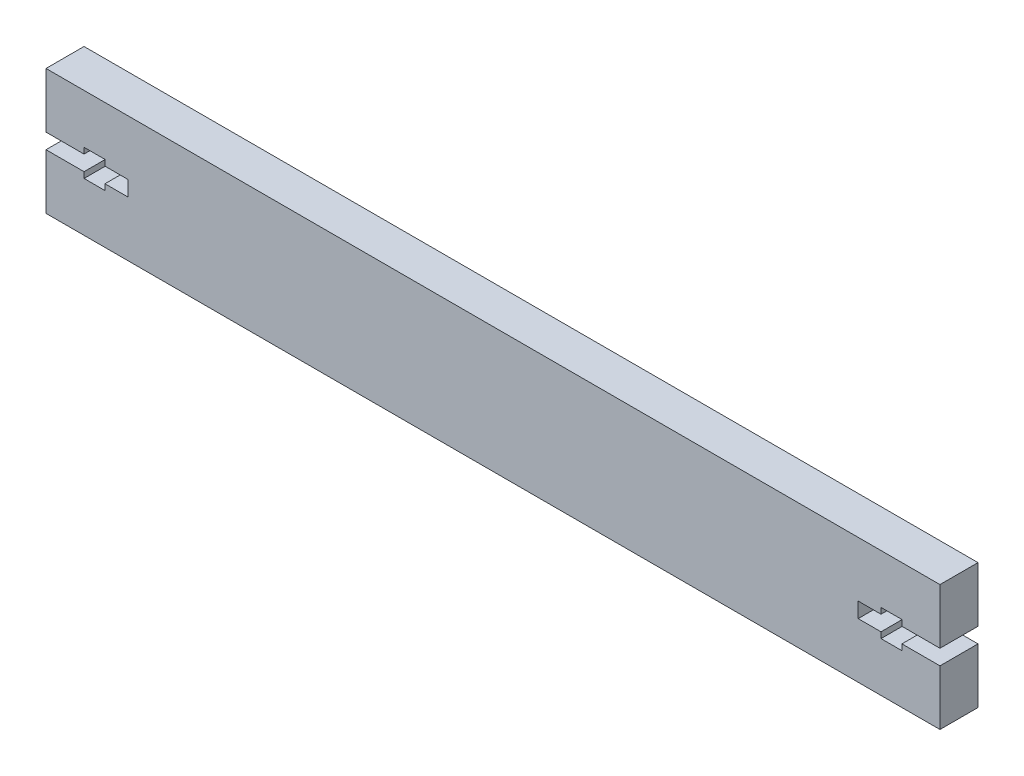
ISO-10303-21;
HEADER;
FILE_DESCRIPTION(('STEP AP214'),'2;1');
FILE_NAME('part.step','',(''),(''),'','','');
FILE_SCHEMA(('AUTOMOTIVE_DESIGN { 1 0 10303 214 1 1 1 1 }'));
ENDSEC;
DATA;
#1=APPLICATION_CONTEXT('core data for automotive mechanical design processes');
#2=APPLICATION_PROTOCOL_DEFINITION('international standard','automotive_design',2000,#1);
#3=PRODUCT_CONTEXT('',#1,'mechanical');
#4=PRODUCT('Part','Part','',(#3));
#5=PRODUCT_RELATED_PRODUCT_CATEGORY('part','',(#4));
#6=PRODUCT_DEFINITION_FORMATION('','',#4);
#7=PRODUCT_DEFINITION_CONTEXT('part definition',#1,'design');
#8=PRODUCT_DEFINITION('design','',#6,#7);
#9=PRODUCT_DEFINITION_SHAPE('','',#8);
#10=(LENGTH_UNIT() NAMED_UNIT(*) SI_UNIT(.MILLI.,.METRE.));
#11=(NAMED_UNIT(*) PLANE_ANGLE_UNIT() SI_UNIT($,.RADIAN.));
#12=(NAMED_UNIT(*) SI_UNIT($,.STERADIAN.) SOLID_ANGLE_UNIT());
#13=UNCERTAINTY_MEASURE_WITH_UNIT(LENGTH_MEASURE(1.E-05),#10,'distance_accuracy_value','');
#14=(GEOMETRIC_REPRESENTATION_CONTEXT(3) GLOBAL_UNCERTAINTY_ASSIGNED_CONTEXT((#13)) GLOBAL_UNIT_ASSIGNED_CONTEXT((#10,
#11,#12)) REPRESENTATION_CONTEXT('',''));
#15=CARTESIAN_POINT('',(0.,0.,0.));
#16=DIRECTION('',(0.,0.,1.));
#17=DIRECTION('',(1.,0.,0.));
#18=AXIS2_PLACEMENT_3D('',#15,#16,#17);
#19=CARTESIAN_POINT('',(117.5,16.5,10.));
#20=DIRECTION('',(-1.,0.,0.));
#21=DIRECTION('',(0.,0.,1.));
#22=AXIS2_PLACEMENT_3D('',#19,#20,#21);
#23=PLANE('',#22);
#24=DIRECTION('',(0.,1.,0.));
#25=VECTOR('',#24,1.);
#26=CARTESIAN_POINT('',(117.5,16.5,0.));
#27=LINE('',#26,#25);
#28=CARTESIAN_POINT('',(117.5,-16.5,0.));
#29=VERTEX_POINT('',#28);
#30=CARTESIAN_POINT('',(117.5,-2.0000000000001,0.));
#31=VERTEX_POINT('',#30);
#32=EDGE_CURVE('E250',#29,#31,#27,.T.);
#33=ORIENTED_EDGE('',*,*,#32,.T.);
#34=DIRECTION('',(0.,0.,1.));
#35=VECTOR('',#34,1.);
#36=CARTESIAN_POINT('',(117.5,-2.0000000000001,0.));
#37=LINE('',#36,#35);
#38=CARTESIAN_POINT('',(117.5,-2.0000000000001,10.));
#39=VERTEX_POINT('',#38);
#40=EDGE_CURVE('E361',#31,#39,#37,.T.);
#41=ORIENTED_EDGE('',*,*,#40,.T.);
#42=DIRECTION('',(0.,1.,0.));
#43=VECTOR('',#42,1.);
#44=CARTESIAN_POINT('',(117.5,16.5,10.));
#45=LINE('',#44,#43);
#46=CARTESIAN_POINT('',(117.5,-16.5,10.));
#47=VERTEX_POINT('',#46);
#48=EDGE_CURVE('E425',#47,#39,#45,.T.);
#49=ORIENTED_EDGE('',*,*,#48,.F.);
#50=DIRECTION('',(0.,0.,-1.));
#51=VECTOR('',#50,1.);
#52=CARTESIAN_POINT('',(117.5,-16.5,10.));
#53=LINE('',#52,#51);
#54=EDGE_CURVE('E256',#47,#29,#53,.T.);
#55=ORIENTED_EDGE('',*,*,#54,.T.);
#56=EDGE_LOOP('',(#33,#41,#49,#55));
#57=FACE_BOUND('',#56,.T.);
#58=ADVANCED_FACE('F37',(#57),#23,.F.);
#59=CARTESIAN_POINT('',(-117.5,16.5,10.));
#60=DIRECTION('',(1.,0.,0.));
#61=DIRECTION('',(0.,1.,0.));
#62=AXIS2_PLACEMENT_3D('',#59,#60,#61);
#63=PLANE('',#62);
#64=DIRECTION('',(0.,-1.,0.));
#65=VECTOR('',#64,1.);
#66=CARTESIAN_POINT('',(-117.5,16.5,0.));
#67=LINE('',#66,#65);
#68=CARTESIAN_POINT('',(-117.5,16.5,0.));
#69=VERTEX_POINT('',#68);
#70=CARTESIAN_POINT('',(-117.5,2.,0.));
#71=VERTEX_POINT('',#70);
#72=EDGE_CURVE('E246',#69,#71,#67,.T.);
#73=ORIENTED_EDGE('',*,*,#72,.T.);
#74=DIRECTION('',(0.,0.,1.));
#75=VECTOR('',#74,1.);
#76=CARTESIAN_POINT('',(-117.5,2.,0.));
#77=LINE('',#76,#75);
#78=CARTESIAN_POINT('',(-117.5,2.,10.));
#79=VERTEX_POINT('',#78);
#80=EDGE_CURVE('E316',#71,#79,#77,.T.);
#81=ORIENTED_EDGE('',*,*,#80,.T.);
#82=DIRECTION('',(0.,-1.,0.));
#83=VECTOR('',#82,1.);
#84=CARTESIAN_POINT('',(-117.5,16.5,10.));
#85=LINE('',#84,#83);
#86=CARTESIAN_POINT('',(-117.5,16.5,10.));
#87=VERTEX_POINT('',#86);
#88=EDGE_CURVE('E269',#87,#79,#85,.T.);
#89=ORIENTED_EDGE('',*,*,#88,.F.);
#90=DIRECTION('',(0.,0.,-1.));
#91=VECTOR('',#90,1.);
#92=CARTESIAN_POINT('',(-117.5,16.5,10.));
#93=LINE('',#92,#91);
#94=EDGE_CURVE('E45',#87,#69,#93,.T.);
#95=ORIENTED_EDGE('',*,*,#94,.T.);
#96=EDGE_LOOP('',(#73,#81,#89,#95));
#97=FACE_BOUND('',#96,.T.);
#98=ADVANCED_FACE('F266',(#97),#63,.F.);
#99=CARTESIAN_POINT('',(117.5,1.9999999999999,10.));
#100=VERTEX_POINT('',#99);
#101=CARTESIAN_POINT('',(117.5,16.5,10.));
#102=VERTEX_POINT('',#101);
#103=EDGE_CURVE('E255',#100,#102,#45,.T.);
#104=ORIENTED_EDGE('',*,*,#103,.F.);
#105=DIRECTION('',(0.,0.,1.));
#106=VECTOR('',#105,1.);
#107=CARTESIAN_POINT('',(117.5,1.9999999999999,0.));
#108=LINE('',#107,#106);
#109=CARTESIAN_POINT('',(117.5,1.9999999999999,0.));
#110=VERTEX_POINT('',#109);
#111=EDGE_CURVE('E338',#110,#100,#108,.T.);
#112=ORIENTED_EDGE('',*,*,#111,.F.);
#113=CARTESIAN_POINT('',(117.5,16.5,0.));
#114=VERTEX_POINT('',#113);
#115=EDGE_CURVE('E318',#110,#114,#27,.T.);
#116=ORIENTED_EDGE('',*,*,#115,.T.);
#117=DIRECTION('',(0.,0.,-1.));
#118=VECTOR('',#117,1.);
#119=CARTESIAN_POINT('',(117.5,16.5,10.));
#120=LINE('',#119,#118);
#121=EDGE_CURVE('E11',#102,#114,#120,.T.);
#122=ORIENTED_EDGE('',*,*,#121,.F.);
#123=EDGE_LOOP('',(#104,#112,#116,#122));
#124=FACE_BOUND('',#123,.T.);
#125=ADVANCED_FACE('F39',(#124),#23,.F.);
#126=CARTESIAN_POINT('',(-117.5,16.5,10.));
#127=DIRECTION('',(0.,-1.,0.));
#128=DIRECTION('',(0.,0.,-1.));
#129=AXIS2_PLACEMENT_3D('',#126,#127,#128);
#130=PLANE('',#129);
#131=DIRECTION('',(-1.,0.,0.));
#132=VECTOR('',#131,1.);
#133=CARTESIAN_POINT('',(-117.5,16.5,0.));
#134=LINE('',#133,#132);
#135=EDGE_CURVE('E247',#114,#69,#134,.T.);
#136=ORIENTED_EDGE('',*,*,#135,.T.);
#137=ORIENTED_EDGE('',*,*,#94,.F.);
#138=DIRECTION('',(-1.,0.,0.));
#139=VECTOR('',#138,1.);
#140=CARTESIAN_POINT('',(-117.5,16.5,10.));
#141=LINE('',#140,#139);
#142=EDGE_CURVE('E428',#102,#87,#141,.T.);
#143=ORIENTED_EDGE('',*,*,#142,.F.);
#144=ORIENTED_EDGE('',*,*,#121,.T.);
#145=EDGE_LOOP('',(#136,#137,#143,#144));
#146=FACE_BOUND('',#145,.T.);
#147=ADVANCED_FACE('F493',(#146),#130,.F.);
#148=CARTESIAN_POINT('',(-117.5,-2.,10.));
#149=VERTEX_POINT('',#148);
#150=CARTESIAN_POINT('',(-117.5,-16.5,10.));
#151=VERTEX_POINT('',#150);
#152=EDGE_CURVE('E238',#149,#151,#85,.T.);
#153=ORIENTED_EDGE('',*,*,#152,.F.);
#154=DIRECTION('',(0.,0.,1.));
#155=VECTOR('',#154,1.);
#156=CARTESIAN_POINT('',(-117.5,-2.,0.));
#157=LINE('',#156,#155);
#158=CARTESIAN_POINT('',(-117.5,-2.,0.));
#159=VERTEX_POINT('',#158);
#160=EDGE_CURVE('E225',#159,#149,#157,.T.);
#161=ORIENTED_EDGE('',*,*,#160,.F.);
#162=CARTESIAN_POINT('',(-117.5,-16.5,0.));
#163=VERTEX_POINT('',#162);
#164=EDGE_CURVE('E236',#159,#163,#67,.T.);
#165=ORIENTED_EDGE('',*,*,#164,.T.);
#166=DIRECTION('',(0.,0.,-1.));
#167=VECTOR('',#166,1.);
#168=CARTESIAN_POINT('',(-117.5,-16.5,10.));
#169=LINE('',#168,#167);
#170=EDGE_CURVE('E259',#151,#163,#169,.T.);
#171=ORIENTED_EDGE('',*,*,#170,.F.);
#172=EDGE_LOOP('',(#153,#161,#165,#171));
#173=FACE_BOUND('',#172,.T.);
#174=ADVANCED_FACE('F234',(#173),#63,.F.);
#175=CARTESIAN_POINT('',(-117.5,-16.5,10.));
#176=DIRECTION('',(0.,1.,0.));
#177=DIRECTION('',(0.,0.,1.));
#178=AXIS2_PLACEMENT_3D('',#175,#176,#177);
#179=PLANE('',#178);
#180=DIRECTION('',(1.,0.,0.));
#181=VECTOR('',#180,1.);
#182=CARTESIAN_POINT('',(-117.5,-16.5,0.));
#183=LINE('',#182,#181);
#184=EDGE_CURVE('E245',#163,#29,#183,.T.);
#185=ORIENTED_EDGE('',*,*,#184,.T.);
#186=ORIENTED_EDGE('',*,*,#54,.F.);
#187=DIRECTION('',(1.,0.,0.));
#188=VECTOR('',#187,1.);
#189=CARTESIAN_POINT('',(-117.5,-16.5,10.));
#190=LINE('',#189,#188);
#191=EDGE_CURVE('E260',#151,#47,#190,.T.);
#192=ORIENTED_EDGE('',*,*,#191,.F.);
#193=ORIENTED_EDGE('',*,*,#170,.T.);
#194=EDGE_LOOP('',(#185,#186,#192,#193));
#195=FACE_BOUND('',#194,.T.);
#196=ADVANCED_FACE('F485',(#195),#179,.F.);
#197=CARTESIAN_POINT('',(0.,0.,10.));
#198=DIRECTION('',(0.,0.,1.));
#199=DIRECTION('',(1.,0.,0.));
#200=AXIS2_PLACEMENT_3D('',#197,#198,#199);
#201=PLANE('',#200);
#202=DIRECTION('',(-1.,0.,0.));
#203=VECTOR('',#202,1.);
#204=CARTESIAN_POINT('',(-117.5,2.,10.));
#205=LINE('',#204,#203);
#206=CARTESIAN_POINT('',(-107.5,2.,10.));
#207=VERTEX_POINT('',#206);
#208=EDGE_CURVE('E230',#207,#79,#205,.T.);
#209=ORIENTED_EDGE('',*,*,#208,.F.);
#210=DIRECTION('',(0.,-1.,0.));
#211=VECTOR('',#210,1.);
#212=CARTESIAN_POINT('',(-107.5,2.,10.));
#213=LINE('',#212,#211);
#214=CARTESIAN_POINT('',(-107.5,3.55,10.));
#215=VERTEX_POINT('',#214);
#216=EDGE_CURVE('E312',#215,#207,#213,.T.);
#217=ORIENTED_EDGE('',*,*,#216,.F.);
#218=DIRECTION('',(-1.,0.,0.));
#219=VECTOR('',#218,1.);
#220=CARTESIAN_POINT('',(-107.5,3.55,10.));
#221=LINE('',#220,#219);
#222=CARTESIAN_POINT('',(-102.,3.55,10.));
#223=VERTEX_POINT('',#222);
#224=EDGE_CURVE('E309',#223,#215,#221,.T.);
#225=ORIENTED_EDGE('',*,*,#224,.F.);
#226=DIRECTION('',(0.,1.,0.));
#227=VECTOR('',#226,1.);
#228=CARTESIAN_POINT('',(-102.,3.55,10.));
#229=LINE('',#228,#227);
#230=CARTESIAN_POINT('',(-102.,2.,10.));
#231=VERTEX_POINT('',#230);
#232=EDGE_CURVE('E306',#231,#223,#229,.T.);
#233=ORIENTED_EDGE('',*,*,#232,.F.);
#234=DIRECTION('',(-1.,0.,0.));
#235=VECTOR('',#234,1.);
#236=CARTESIAN_POINT('',(-102.,2.,10.));
#237=LINE('',#236,#235);
#238=CARTESIAN_POINT('',(-96.,2.,10.));
#239=VERTEX_POINT('',#238);
#240=EDGE_CURVE('E303',#239,#231,#237,.T.);
#241=ORIENTED_EDGE('',*,*,#240,.F.);
#242=DIRECTION('',(0.,1.,0.));
#243=VECTOR('',#242,1.);
#244=CARTESIAN_POINT('',(-96.,2.,10.));
#245=LINE('',#244,#243);
#246=CARTESIAN_POINT('',(-96.,-2.,10.));
#247=VERTEX_POINT('',#246);
#248=EDGE_CURVE('E300',#247,#239,#245,.T.);
#249=ORIENTED_EDGE('',*,*,#248,.F.);
#250=DIRECTION('',(1.,0.,0.));
#251=VECTOR('',#250,1.);
#252=CARTESIAN_POINT('',(-102.,-2.,10.));
#253=LINE('',#252,#251);
#254=CARTESIAN_POINT('',(-102.,-2.,10.));
#255=VERTEX_POINT('',#254);
#256=EDGE_CURVE('E297',#255,#247,#253,.T.);
#257=ORIENTED_EDGE('',*,*,#256,.F.);
#258=DIRECTION('',(0.,1.,0.));
#259=VECTOR('',#258,1.);
#260=CARTESIAN_POINT('',(-102.,-3.55,10.));
#261=LINE('',#260,#259);
#262=CARTESIAN_POINT('',(-102.,-3.55,10.));
#263=VERTEX_POINT('',#262);
#264=EDGE_CURVE('E294',#263,#255,#261,.T.);
#265=ORIENTED_EDGE('',*,*,#264,.F.);
#266=DIRECTION('',(1.,0.,0.));
#267=VECTOR('',#266,1.);
#268=CARTESIAN_POINT('',(-107.5,-3.55,10.));
#269=LINE('',#268,#267);
#270=CARTESIAN_POINT('',(-107.5,-3.55,10.));
#271=VERTEX_POINT('',#270);
#272=EDGE_CURVE('E291',#271,#263,#269,.T.);
#273=ORIENTED_EDGE('',*,*,#272,.F.);
#274=DIRECTION('',(0.,-1.,0.));
#275=VECTOR('',#274,1.);
#276=CARTESIAN_POINT('',(-107.5,-2.,10.));
#277=LINE('',#276,#275);
#278=CARTESIAN_POINT('',(-107.5,-2.,10.));
#279=VERTEX_POINT('',#278);
#280=EDGE_CURVE('E287',#279,#271,#277,.T.);
#281=ORIENTED_EDGE('',*,*,#280,.F.);
#282=DIRECTION('',(1.,0.,0.));
#283=VECTOR('',#282,1.);
#284=CARTESIAN_POINT('',(-117.5,-2.,10.));
#285=LINE('',#284,#283);
#286=EDGE_CURVE('E285',#149,#279,#285,.T.);
#287=ORIENTED_EDGE('',*,*,#286,.F.);
#288=ORIENTED_EDGE('',*,*,#152,.T.);
#289=ORIENTED_EDGE('',*,*,#191,.T.);
#290=ORIENTED_EDGE('',*,*,#48,.T.);
#291=DIRECTION('',(1.,0.,0.));
#292=VECTOR('',#291,1.);
#293=CARTESIAN_POINT('',(117.5,-2.0000000000001,10.));
#294=LINE('',#293,#292);
#295=CARTESIAN_POINT('',(107.5,-2.00000000000009,10.));
#296=VERTEX_POINT('',#295);
#297=EDGE_CURVE('E364',#296,#39,#294,.T.);
#298=ORIENTED_EDGE('',*,*,#297,.F.);
#299=DIRECTION('',(0.,1.,0.));
#300=VECTOR('',#299,1.);
#301=CARTESIAN_POINT('',(107.5,-2.00000000000009,10.));
#302=LINE('',#301,#300);
#303=CARTESIAN_POINT('',(107.5,-3.55000000000009,10.));
#304=VERTEX_POINT('',#303);
#305=EDGE_CURVE('E366',#304,#296,#302,.T.);
#306=ORIENTED_EDGE('',*,*,#305,.F.);
#307=DIRECTION('',(1.,0.,0.));
#308=VECTOR('',#307,1.);
#309=CARTESIAN_POINT('',(107.5,-3.55000000000009,10.));
#310=LINE('',#309,#308);
#311=CARTESIAN_POINT('',(102.,-3.55000000000008,10.));
#312=VERTEX_POINT('',#311);
#313=EDGE_CURVE('E370',#312,#304,#310,.T.);
#314=ORIENTED_EDGE('',*,*,#313,.F.);
#315=DIRECTION('',(0.,-1.,0.));
#316=VECTOR('',#315,1.);
#317=CARTESIAN_POINT('',(102.,-3.55000000000008,10.));
#318=LINE('',#317,#316);
#319=CARTESIAN_POINT('',(102.,-2.00000000000008,10.));
#320=VERTEX_POINT('',#319);
#321=EDGE_CURVE('E373',#320,#312,#318,.T.);
#322=ORIENTED_EDGE('',*,*,#321,.F.);
#323=DIRECTION('',(1.,0.,0.));
#324=VECTOR('',#323,1.);
#325=CARTESIAN_POINT('',(102.,-2.00000000000008,10.));
#326=LINE('',#325,#324);
#327=CARTESIAN_POINT('',(96.,-2.00000000000008,10.));
#328=VERTEX_POINT('',#327);
#329=EDGE_CURVE('E376',#328,#320,#326,.T.);
#330=ORIENTED_EDGE('',*,*,#329,.F.);
#331=DIRECTION('',(0.,-1.,0.));
#332=VECTOR('',#331,1.);
#333=CARTESIAN_POINT('',(96.,1.99999999999992,10.));
#334=LINE('',#333,#332);
#335=CARTESIAN_POINT('',(96.,1.99999999999992,10.));
#336=VERTEX_POINT('',#335);
#337=EDGE_CURVE('E379',#336,#328,#334,.T.);
#338=ORIENTED_EDGE('',*,*,#337,.F.);
#339=DIRECTION('',(-1.,0.,0.));
#340=VECTOR('',#339,1.);
#341=CARTESIAN_POINT('',(102.,1.99999999999991,10.));
#342=LINE('',#341,#340);
#343=CARTESIAN_POINT('',(102.,1.99999999999991,10.));
#344=VERTEX_POINT('',#343);
#345=EDGE_CURVE('E382',#344,#336,#342,.T.);
#346=ORIENTED_EDGE('',*,*,#345,.F.);
#347=DIRECTION('',(0.,-1.,0.));
#348=VECTOR('',#347,1.);
#349=CARTESIAN_POINT('',(102.,3.54999999999991,10.));
#350=LINE('',#349,#348);
#351=CARTESIAN_POINT('',(102.,3.54999999999991,10.));
#352=VERTEX_POINT('',#351);
#353=EDGE_CURVE('E385',#352,#344,#350,.T.);
#354=ORIENTED_EDGE('',*,*,#353,.F.);
#355=DIRECTION('',(-1.,0.,0.));
#356=VECTOR('',#355,1.);
#357=CARTESIAN_POINT('',(107.5,3.54999999999991,10.));
#358=LINE('',#357,#356);
#359=CARTESIAN_POINT('',(107.5,3.54999999999991,10.));
#360=VERTEX_POINT('',#359);
#361=EDGE_CURVE('E388',#360,#352,#358,.T.);
#362=ORIENTED_EDGE('',*,*,#361,.F.);
#363=DIRECTION('',(0.,1.,0.));
#364=VECTOR('',#363,1.);
#365=CARTESIAN_POINT('',(107.5,1.99999999999991,10.));
#366=LINE('',#365,#364);
#367=CARTESIAN_POINT('',(107.5,1.99999999999991,10.));
#368=VERTEX_POINT('',#367);
#369=EDGE_CURVE('E391',#368,#360,#366,.T.);
#370=ORIENTED_EDGE('',*,*,#369,.F.);
#371=DIRECTION('',(-1.,0.,0.));
#372=VECTOR('',#371,1.);
#373=CARTESIAN_POINT('',(117.5,1.9999999999999,10.));
#374=LINE('',#373,#372);
#375=EDGE_CURVE('E288',#100,#368,#374,.T.);
#376=ORIENTED_EDGE('',*,*,#375,.F.);
#377=ORIENTED_EDGE('',*,*,#103,.T.);
#378=ORIENTED_EDGE('',*,*,#142,.T.);
#379=ORIENTED_EDGE('',*,*,#88,.T.);
#380=EDGE_LOOP('',(#209,#217,#225,#233,#241,#249,#257,#265,#273,#281,#287,#288,#289,#290,#298,
#306,#314,#322,#330,#338,#346,#354,#362,#370,#376,#377,#378,#379));
#381=FACE_BOUND('',#380,.T.);
#382=ADVANCED_FACE('F447',(#381),#201,.T.);
#383=CARTESIAN_POINT('',(0.,0.,0.));
#384=DIRECTION('',(0.,0.,1.));
#385=DIRECTION('',(1.,0.,0.));
#386=AXIS2_PLACEMENT_3D('',#383,#384,#385);
#387=PLANE('',#386);
#388=DIRECTION('',(0.,-1.,0.));
#389=VECTOR('',#388,1.);
#390=CARTESIAN_POINT('',(-107.5,2.,0.));
#391=LINE('',#390,#389);
#392=CARTESIAN_POINT('',(-107.5,3.55,0.));
#393=VERTEX_POINT('',#392);
#394=CARTESIAN_POINT('',(-107.5,2.,0.));
#395=VERTEX_POINT('',#394);
#396=EDGE_CURVE('E278',#393,#395,#391,.T.);
#397=ORIENTED_EDGE('',*,*,#396,.T.);
#398=DIRECTION('',(-1.,0.,0.));
#399=VECTOR('',#398,1.);
#400=CARTESIAN_POINT('',(-117.5,2.,0.));
#401=LINE('',#400,#399);
#402=EDGE_CURVE('E239',#395,#71,#401,.T.);
#403=ORIENTED_EDGE('',*,*,#402,.T.);
#404=ORIENTED_EDGE('',*,*,#72,.F.);
#405=ORIENTED_EDGE('',*,*,#135,.F.);
#406=ORIENTED_EDGE('',*,*,#115,.F.);
#407=DIRECTION('',(-1.,0.,0.));
#408=VECTOR('',#407,1.);
#409=CARTESIAN_POINT('',(117.5,1.9999999999999,0.));
#410=LINE('',#409,#408);
#411=CARTESIAN_POINT('',(107.5,1.99999999999991,0.));
#412=VERTEX_POINT('',#411);
#413=EDGE_CURVE('E367',#110,#412,#410,.T.);
#414=ORIENTED_EDGE('',*,*,#413,.T.);
#415=DIRECTION('',(0.,1.,0.));
#416=VECTOR('',#415,1.);
#417=CARTESIAN_POINT('',(107.5,1.99999999999991,0.));
#418=LINE('',#417,#416);
#419=CARTESIAN_POINT('',(107.5,3.54999999999991,0.));
#420=VERTEX_POINT('',#419);
#421=EDGE_CURVE('E60',#412,#420,#418,.T.);
#422=ORIENTED_EDGE('',*,*,#421,.T.);
#423=DIRECTION('',(-1.,0.,0.));
#424=VECTOR('',#423,1.);
#425=CARTESIAN_POINT('',(107.5,3.54999999999991,0.));
#426=LINE('',#425,#424);
#427=CARTESIAN_POINT('',(102.,3.54999999999991,0.));
#428=VERTEX_POINT('',#427);
#429=EDGE_CURVE('E419',#420,#428,#426,.T.);
#430=ORIENTED_EDGE('',*,*,#429,.T.);
#431=DIRECTION('',(0.,-1.,0.));
#432=VECTOR('',#431,1.);
#433=CARTESIAN_POINT('',(102.,3.54999999999991,0.));
#434=LINE('',#433,#432);
#435=CARTESIAN_POINT('',(102.,1.99999999999991,0.));
#436=VERTEX_POINT('',#435);
#437=EDGE_CURVE('E416',#428,#436,#434,.T.);
#438=ORIENTED_EDGE('',*,*,#437,.T.);
#439=DIRECTION('',(-1.,0.,0.));
#440=VECTOR('',#439,1.);
#441=CARTESIAN_POINT('',(102.,1.99999999999991,0.));
#442=LINE('',#441,#440);
#443=CARTESIAN_POINT('',(96.,1.99999999999992,0.));
#444=VERTEX_POINT('',#443);
#445=EDGE_CURVE('E413',#436,#444,#442,.T.);
#446=ORIENTED_EDGE('',*,*,#445,.T.);
#447=DIRECTION('',(0.,-1.,0.));
#448=VECTOR('',#447,1.);
#449=CARTESIAN_POINT('',(96.,1.99999999999992,0.));
#450=LINE('',#449,#448);
#451=CARTESIAN_POINT('',(96.,-2.00000000000008,0.));
#452=VERTEX_POINT('',#451);
#453=EDGE_CURVE('E410',#444,#452,#450,.T.);
#454=ORIENTED_EDGE('',*,*,#453,.T.);
#455=DIRECTION('',(1.,0.,0.));
#456=VECTOR('',#455,1.);
#457=CARTESIAN_POINT('',(102.,-2.00000000000008,0.));
#458=LINE('',#457,#456);
#459=CARTESIAN_POINT('',(102.,-2.00000000000008,0.));
#460=VERTEX_POINT('',#459);
#461=EDGE_CURVE('E407',#452,#460,#458,.T.);
#462=ORIENTED_EDGE('',*,*,#461,.T.);
#463=DIRECTION('',(0.,-1.,0.));
#464=VECTOR('',#463,1.);
#465=CARTESIAN_POINT('',(102.,-3.55000000000008,0.));
#466=LINE('',#465,#464);
#467=CARTESIAN_POINT('',(102.,-3.55000000000008,0.));
#468=VERTEX_POINT('',#467);
#469=EDGE_CURVE('E404',#460,#468,#466,.T.);
#470=ORIENTED_EDGE('',*,*,#469,.T.);
#471=DIRECTION('',(1.,0.,0.));
#472=VECTOR('',#471,1.);
#473=CARTESIAN_POINT('',(107.5,-3.55000000000009,0.));
#474=LINE('',#473,#472);
#475=CARTESIAN_POINT('',(107.5,-3.55000000000009,0.));
#476=VERTEX_POINT('',#475);
#477=EDGE_CURVE('E401',#468,#476,#474,.T.);
#478=ORIENTED_EDGE('',*,*,#477,.T.);
#479=DIRECTION('',(0.,1.,0.));
#480=VECTOR('',#479,1.);
#481=CARTESIAN_POINT('',(107.5,-2.00000000000009,0.));
#482=LINE('',#481,#480);
#483=CARTESIAN_POINT('',(107.5,-2.00000000000009,0.));
#484=VERTEX_POINT('',#483);
#485=EDGE_CURVE('E398',#476,#484,#482,.T.);
#486=ORIENTED_EDGE('',*,*,#485,.T.);
#487=DIRECTION('',(1.,0.,0.));
#488=VECTOR('',#487,1.);
#489=CARTESIAN_POINT('',(117.5,-2.0000000000001,0.));
#490=LINE('',#489,#488);
#491=EDGE_CURVE('E340',#484,#31,#490,.T.);
#492=ORIENTED_EDGE('',*,*,#491,.T.);
#493=ORIENTED_EDGE('',*,*,#32,.F.);
#494=ORIENTED_EDGE('',*,*,#184,.F.);
#495=ORIENTED_EDGE('',*,*,#164,.F.);
#496=DIRECTION('',(1.,0.,0.));
#497=VECTOR('',#496,1.);
#498=CARTESIAN_POINT('',(-117.5,-2.,0.));
#499=LINE('',#498,#497);
#500=CARTESIAN_POINT('',(-107.5,-2.,0.));
#501=VERTEX_POINT('',#500);
#502=EDGE_CURVE('E221',#159,#501,#499,.T.);
#503=ORIENTED_EDGE('',*,*,#502,.T.);
#504=DIRECTION('',(0.,-1.,0.));
#505=VECTOR('',#504,1.);
#506=CARTESIAN_POINT('',(-107.5,-2.,0.));
#507=LINE('',#506,#505);
#508=CARTESIAN_POINT('',(-107.5,-3.55,0.));
#509=VERTEX_POINT('',#508);
#510=EDGE_CURVE('E52',#501,#509,#507,.T.);
#511=ORIENTED_EDGE('',*,*,#510,.T.);
#512=DIRECTION('',(1.,0.,0.));
#513=VECTOR('',#512,1.);
#514=CARTESIAN_POINT('',(-107.5,-3.55,0.));
#515=LINE('',#514,#513);
#516=CARTESIAN_POINT('',(-102.,-3.55,0.));
#517=VERTEX_POINT('',#516);
#518=EDGE_CURVE('E550',#509,#517,#515,.T.);
#519=ORIENTED_EDGE('',*,*,#518,.T.);
#520=DIRECTION('',(0.,1.,0.));
#521=VECTOR('',#520,1.);
#522=CARTESIAN_POINT('',(-102.,-3.55,0.));
#523=LINE('',#522,#521);
#524=CARTESIAN_POINT('',(-102.,-2.,0.));
#525=VERTEX_POINT('',#524);
#526=EDGE_CURVE('E543',#517,#525,#523,.T.);
#527=ORIENTED_EDGE('',*,*,#526,.T.);
#528=DIRECTION('',(1.,0.,0.));
#529=VECTOR('',#528,1.);
#530=CARTESIAN_POINT('',(-102.,-2.,0.));
#531=LINE('',#530,#529);
#532=CARTESIAN_POINT('',(-96.,-2.,0.));
#533=VERTEX_POINT('',#532);
#534=EDGE_CURVE('E538',#525,#533,#531,.T.);
#535=ORIENTED_EDGE('',*,*,#534,.T.);
#536=DIRECTION('',(0.,1.,0.));
#537=VECTOR('',#536,1.);
#538=CARTESIAN_POINT('',(-96.,2.,0.));
#539=LINE('',#538,#537);
#540=CARTESIAN_POINT('',(-96.,2.,0.));
#541=VERTEX_POINT('',#540);
#542=EDGE_CURVE('E556',#533,#541,#539,.T.);
#543=ORIENTED_EDGE('',*,*,#542,.T.);
#544=DIRECTION('',(-1.,0.,0.));
#545=VECTOR('',#544,1.);
#546=CARTESIAN_POINT('',(-102.,2.,0.));
#547=LINE('',#546,#545);
#548=CARTESIAN_POINT('',(-102.,2.,0.));
#549=VERTEX_POINT('',#548);
#550=EDGE_CURVE('E526',#541,#549,#547,.T.);
#551=ORIENTED_EDGE('',*,*,#550,.T.);
#552=DIRECTION('',(0.,1.,0.));
#553=VECTOR('',#552,1.);
#554=CARTESIAN_POINT('',(-102.,3.55,0.));
#555=LINE('',#554,#553);
#556=CARTESIAN_POINT('',(-102.,3.55,0.));
#557=VERTEX_POINT('',#556);
#558=EDGE_CURVE('E521',#549,#557,#555,.T.);
#559=ORIENTED_EDGE('',*,*,#558,.T.);
#560=DIRECTION('',(-1.,0.,0.));
#561=VECTOR('',#560,1.);
#562=CARTESIAN_POINT('',(-107.5,3.55,0.));
#563=LINE('',#562,#561);
#564=EDGE_CURVE('E281',#557,#393,#563,.T.);
#565=ORIENTED_EDGE('',*,*,#564,.T.);
#566=EDGE_LOOP('',(#397,#403,#404,#405,#406,#414,#422,#430,#438,#446,#454,#462,#470,#478,#486,
#492,#493,#494,#495,#503,#511,#519,#527,#535,#543,#551,#559,#565));
#567=FACE_BOUND('',#566,.T.);
#568=ADVANCED_FACE('F243',(#567),#387,.F.);
#569=CARTESIAN_POINT('',(117.5,-2.0000000000001,0.));
#570=DIRECTION('',(0.,-1.,0.));
#571=DIRECTION('',(1.,0.,0.));
#572=AXIS2_PLACEMENT_3D('',#569,#570,#571);
#573=PLANE('',#572);
#574=ORIENTED_EDGE('',*,*,#297,.T.);
#575=ORIENTED_EDGE('',*,*,#40,.F.);
#576=ORIENTED_EDGE('',*,*,#491,.F.);
#577=DIRECTION('',(0.,0.,1.));
#578=VECTOR('',#577,1.);
#579=CARTESIAN_POINT('',(107.5,-2.00000000000009,0.));
#580=LINE('',#579,#578);
#581=EDGE_CURVE('E359',#484,#296,#580,.T.);
#582=ORIENTED_EDGE('',*,*,#581,.T.);
#583=EDGE_LOOP('',(#574,#575,#576,#582));
#584=FACE_BOUND('',#583,.T.);
#585=ADVANCED_FACE('F480',(#584),#573,.F.);
#586=CARTESIAN_POINT('',(107.5,-2.00000000000009,0.));
#587=DIRECTION('',(1.,0.,0.));
#588=DIRECTION('',(0.,0.,-1.));
#589=AXIS2_PLACEMENT_3D('',#586,#587,#588);
#590=PLANE('',#589);
#591=ORIENTED_EDGE('',*,*,#305,.T.);
#592=ORIENTED_EDGE('',*,*,#581,.F.);
#593=ORIENTED_EDGE('',*,*,#485,.F.);
#594=DIRECTION('',(0.,0.,1.));
#595=VECTOR('',#594,1.);
#596=CARTESIAN_POINT('',(107.5,-3.55000000000009,0.));
#597=LINE('',#596,#595);
#598=EDGE_CURVE('E357',#476,#304,#597,.T.);
#599=ORIENTED_EDGE('',*,*,#598,.T.);
#600=EDGE_LOOP('',(#591,#592,#593,#599));
#601=FACE_BOUND('',#600,.T.);
#602=ADVANCED_FACE('F476',(#601),#590,.F.);
#603=CARTESIAN_POINT('',(107.5,-3.55000000000009,0.));
#604=DIRECTION('',(0.,-1.,0.));
#605=DIRECTION('',(1.,0.,0.));
#606=AXIS2_PLACEMENT_3D('',#603,#604,#605);
#607=PLANE('',#606);
#608=ORIENTED_EDGE('',*,*,#313,.T.);
#609=ORIENTED_EDGE('',*,*,#598,.F.);
#610=ORIENTED_EDGE('',*,*,#477,.F.);
#611=DIRECTION('',(0.,0.,1.));
#612=VECTOR('',#611,1.);
#613=CARTESIAN_POINT('',(102.,-3.55000000000008,0.));
#614=LINE('',#613,#612);
#615=EDGE_CURVE('E355',#468,#312,#614,.T.);
#616=ORIENTED_EDGE('',*,*,#615,.T.);
#617=EDGE_LOOP('',(#608,#609,#610,#616));
#618=FACE_BOUND('',#617,.T.);
#619=ADVANCED_FACE('F472',(#618),#607,.F.);
#620=CARTESIAN_POINT('',(102.,-3.55000000000008,0.));
#621=DIRECTION('',(-1.,0.,0.));
#622=DIRECTION('',(0.,0.,1.));
#623=AXIS2_PLACEMENT_3D('',#620,#621,#622);
#624=PLANE('',#623);
#625=ORIENTED_EDGE('',*,*,#321,.T.);
#626=ORIENTED_EDGE('',*,*,#615,.F.);
#627=ORIENTED_EDGE('',*,*,#469,.F.);
#628=DIRECTION('',(0.,0.,1.));
#629=VECTOR('',#628,1.);
#630=CARTESIAN_POINT('',(102.,-2.00000000000008,0.));
#631=LINE('',#630,#629);
#632=EDGE_CURVE('E353',#460,#320,#631,.T.);
#633=ORIENTED_EDGE('',*,*,#632,.T.);
#634=EDGE_LOOP('',(#625,#626,#627,#633));
#635=FACE_BOUND('',#634,.T.);
#636=ADVANCED_FACE('F468',(#635),#624,.F.);
#637=CARTESIAN_POINT('',(102.,-2.00000000000008,0.));
#638=DIRECTION('',(0.,-1.,0.));
#639=DIRECTION('',(0.,0.,-1.));
#640=AXIS2_PLACEMENT_3D('',#637,#638,#639);
#641=PLANE('',#640);
#642=ORIENTED_EDGE('',*,*,#329,.T.);
#643=ORIENTED_EDGE('',*,*,#632,.F.);
#644=ORIENTED_EDGE('',*,*,#461,.F.);
#645=DIRECTION('',(0.,0.,1.));
#646=VECTOR('',#645,1.);
#647=CARTESIAN_POINT('',(96.,-2.00000000000008,0.));
#648=LINE('',#647,#646);
#649=EDGE_CURVE('E351',#452,#328,#648,.T.);
#650=ORIENTED_EDGE('',*,*,#649,.T.);
#651=EDGE_LOOP('',(#642,#643,#644,#650));
#652=FACE_BOUND('',#651,.T.);
#653=ADVANCED_FACE('F464',(#652),#641,.F.);
#654=CARTESIAN_POINT('',(96.,1.99999999999992,0.));
#655=DIRECTION('',(-1.,0.,0.));
#656=DIRECTION('',(0.,-1.,0.));
#657=AXIS2_PLACEMENT_3D('',#654,#655,#656);
#658=PLANE('',#657);
#659=ORIENTED_EDGE('',*,*,#337,.T.);
#660=ORIENTED_EDGE('',*,*,#649,.F.);
#661=ORIENTED_EDGE('',*,*,#453,.F.);
#662=DIRECTION('',(0.,0.,1.));
#663=VECTOR('',#662,1.);
#664=CARTESIAN_POINT('',(96.,1.99999999999992,0.));
#665=LINE('',#664,#663);
#666=EDGE_CURVE('E349',#444,#336,#665,.T.);
#667=ORIENTED_EDGE('',*,*,#666,.T.);
#668=EDGE_LOOP('',(#659,#660,#661,#667));
#669=FACE_BOUND('',#668,.T.);
#670=ADVANCED_FACE('F460',(#669),#658,.F.);
#671=CARTESIAN_POINT('',(102.,1.99999999999991,0.));
#672=DIRECTION('',(0.,1.,0.));
#673=DIRECTION('',(-1.,0.,0.));
#674=AXIS2_PLACEMENT_3D('',#671,#672,#673);
#675=PLANE('',#674);
#676=ORIENTED_EDGE('',*,*,#345,.T.);
#677=ORIENTED_EDGE('',*,*,#666,.F.);
#678=ORIENTED_EDGE('',*,*,#445,.F.);
#679=DIRECTION('',(0.,0.,1.));
#680=VECTOR('',#679,1.);
#681=CARTESIAN_POINT('',(102.,1.99999999999991,0.));
#682=LINE('',#681,#680);
#683=EDGE_CURVE('E347',#436,#344,#682,.T.);
#684=ORIENTED_EDGE('',*,*,#683,.T.);
#685=EDGE_LOOP('',(#676,#677,#678,#684));
#686=FACE_BOUND('',#685,.T.);
#687=ADVANCED_FACE('F456',(#686),#675,.F.);
#688=CARTESIAN_POINT('',(102.,3.54999999999991,0.));
#689=DIRECTION('',(-1.,0.,0.));
#690=DIRECTION('',(0.,0.,1.));
#691=AXIS2_PLACEMENT_3D('',#688,#689,#690);
#692=PLANE('',#691);
#693=ORIENTED_EDGE('',*,*,#353,.T.);
#694=ORIENTED_EDGE('',*,*,#683,.F.);
#695=ORIENTED_EDGE('',*,*,#437,.F.);
#696=DIRECTION('',(0.,0.,1.));
#697=VECTOR('',#696,1.);
#698=CARTESIAN_POINT('',(102.,3.54999999999991,0.));
#699=LINE('',#698,#697);
#700=EDGE_CURVE('E345',#428,#352,#699,.T.);
#701=ORIENTED_EDGE('',*,*,#700,.T.);
#702=EDGE_LOOP('',(#693,#694,#695,#701));
#703=FACE_BOUND('',#702,.T.);
#704=ADVANCED_FACE('F454',(#703),#692,.F.);
#705=CARTESIAN_POINT('',(107.5,3.54999999999991,0.));
#706=DIRECTION('',(0.,1.,0.));
#707=DIRECTION('',(-1.,0.,0.));
#708=AXIS2_PLACEMENT_3D('',#705,#706,#707);
#709=PLANE('',#708);
#710=ORIENTED_EDGE('',*,*,#361,.T.);
#711=ORIENTED_EDGE('',*,*,#700,.F.);
#712=ORIENTED_EDGE('',*,*,#429,.F.);
#713=DIRECTION('',(0.,0.,1.));
#714=VECTOR('',#713,1.);
#715=CARTESIAN_POINT('',(107.5,3.54999999999991,0.));
#716=LINE('',#715,#714);
#717=EDGE_CURVE('E343',#420,#360,#716,.T.);
#718=ORIENTED_EDGE('',*,*,#717,.T.);
#719=EDGE_LOOP('',(#710,#711,#712,#718));
#720=FACE_BOUND('',#719,.T.);
#721=ADVANCED_FACE('F450',(#720),#709,.F.);
#722=CARTESIAN_POINT('',(107.5,1.99999999999991,0.));
#723=DIRECTION('',(1.,0.,0.));
#724=DIRECTION('',(0.,0.,-1.));
#725=AXIS2_PLACEMENT_3D('',#722,#723,#724);
#726=PLANE('',#725);
#727=ORIENTED_EDGE('',*,*,#369,.T.);
#728=ORIENTED_EDGE('',*,*,#717,.F.);
#729=ORIENTED_EDGE('',*,*,#421,.F.);
#730=DIRECTION('',(0.,0.,1.));
#731=VECTOR('',#730,1.);
#732=CARTESIAN_POINT('',(107.5,1.99999999999991,0.));
#733=LINE('',#732,#731);
#734=EDGE_CURVE('E341',#412,#368,#733,.T.);
#735=ORIENTED_EDGE('',*,*,#734,.T.);
#736=EDGE_LOOP('',(#727,#728,#729,#735));
#737=FACE_BOUND('',#736,.T.);
#738=ADVANCED_FACE('F441',(#737),#726,.F.);
#739=CARTESIAN_POINT('',(117.5,1.9999999999999,0.));
#740=DIRECTION('',(0.,1.,0.));
#741=DIRECTION('',(-1.,0.,0.));
#742=AXIS2_PLACEMENT_3D('',#739,#740,#741);
#743=PLANE('',#742);
#744=ORIENTED_EDGE('',*,*,#375,.T.);
#745=ORIENTED_EDGE('',*,*,#734,.F.);
#746=ORIENTED_EDGE('',*,*,#413,.F.);
#747=ORIENTED_EDGE('',*,*,#111,.T.);
#748=EDGE_LOOP('',(#744,#745,#746,#747));
#749=FACE_BOUND('',#748,.T.);
#750=ADVANCED_FACE('F438',(#749),#743,.F.);
#751=CARTESIAN_POINT('',(-117.5,2.,0.));
#752=DIRECTION('',(0.,1.,0.));
#753=DIRECTION('',(0.,0.,1.));
#754=AXIS2_PLACEMENT_3D('',#751,#752,#753);
#755=PLANE('',#754);
#756=ORIENTED_EDGE('',*,*,#208,.T.);
#757=ORIENTED_EDGE('',*,*,#80,.F.);
#758=ORIENTED_EDGE('',*,*,#402,.F.);
#759=DIRECTION('',(0.,0.,1.));
#760=VECTOR('',#759,1.);
#761=CARTESIAN_POINT('',(-107.5,2.,0.));
#762=LINE('',#761,#760);
#763=EDGE_CURVE('E319',#395,#207,#762,.T.);
#764=ORIENTED_EDGE('',*,*,#763,.T.);
#765=EDGE_LOOP('',(#756,#757,#758,#764));
#766=FACE_BOUND('',#765,.T.);
#767=ADVANCED_FACE('F508',(#766),#755,.F.);
#768=CARTESIAN_POINT('',(-107.5,2.,0.));
#769=DIRECTION('',(-1.,0.,0.));
#770=DIRECTION('',(0.,0.,1.));
#771=AXIS2_PLACEMENT_3D('',#768,#769,#770);
#772=PLANE('',#771);
#773=ORIENTED_EDGE('',*,*,#216,.T.);
#774=ORIENTED_EDGE('',*,*,#763,.F.);
#775=ORIENTED_EDGE('',*,*,#396,.F.);
#776=DIRECTION('',(0.,0.,1.));
#777=VECTOR('',#776,1.);
#778=CARTESIAN_POINT('',(-107.5,3.55,0.));
#779=LINE('',#778,#777);
#780=EDGE_CURVE('E321',#393,#215,#779,.T.);
#781=ORIENTED_EDGE('',*,*,#780,.T.);
#782=EDGE_LOOP('',(#773,#774,#775,#781));
#783=FACE_BOUND('',#782,.T.);
#784=ADVANCED_FACE('F510',(#783),#772,.F.);
#785=CARTESIAN_POINT('',(-107.5,3.55,0.));
#786=DIRECTION('',(0.,1.,0.));
#787=DIRECTION('',(0.,0.,1.));
#788=AXIS2_PLACEMENT_3D('',#785,#786,#787);
#789=PLANE('',#788);
#790=ORIENTED_EDGE('',*,*,#224,.T.);
#791=ORIENTED_EDGE('',*,*,#780,.F.);
#792=ORIENTED_EDGE('',*,*,#564,.F.);
#793=DIRECTION('',(0.,0.,1.));
#794=VECTOR('',#793,1.);
#795=CARTESIAN_POINT('',(-102.,3.55,0.));
#796=LINE('',#795,#794);
#797=EDGE_CURVE('E323',#557,#223,#796,.T.);
#798=ORIENTED_EDGE('',*,*,#797,.T.);
#799=EDGE_LOOP('',(#790,#791,#792,#798));
#800=FACE_BOUND('',#799,.T.);
#801=ADVANCED_FACE('F513',(#800),#789,.F.);
#802=CARTESIAN_POINT('',(-102.,3.55,0.));
#803=DIRECTION('',(1.,0.,0.));
#804=DIRECTION('',(0.,0.,-1.));
#805=AXIS2_PLACEMENT_3D('',#802,#803,#804);
#806=PLANE('',#805);
#807=ORIENTED_EDGE('',*,*,#232,.T.);
#808=ORIENTED_EDGE('',*,*,#797,.F.);
#809=ORIENTED_EDGE('',*,*,#558,.F.);
#810=DIRECTION('',(0.,0.,1.));
#811=VECTOR('',#810,1.);
#812=CARTESIAN_POINT('',(-102.,2.,0.));
#813=LINE('',#812,#811);
#814=EDGE_CURVE('E325',#549,#231,#813,.T.);
#815=ORIENTED_EDGE('',*,*,#814,.T.);
#816=EDGE_LOOP('',(#807,#808,#809,#815));
#817=FACE_BOUND('',#816,.T.);
#818=ADVANCED_FACE('F518',(#817),#806,.F.);
#819=CARTESIAN_POINT('',(-102.,2.,0.));
#820=DIRECTION('',(0.,1.,0.));
#821=DIRECTION('',(0.,0.,1.));
#822=AXIS2_PLACEMENT_3D('',#819,#820,#821);
#823=PLANE('',#822);
#824=ORIENTED_EDGE('',*,*,#240,.T.);
#825=ORIENTED_EDGE('',*,*,#814,.F.);
#826=ORIENTED_EDGE('',*,*,#550,.F.);
#827=DIRECTION('',(0.,0.,1.));
#828=VECTOR('',#827,1.);
#829=CARTESIAN_POINT('',(-96.,2.,0.));
#830=LINE('',#829,#828);
#831=EDGE_CURVE('E327',#541,#239,#830,.T.);
#832=ORIENTED_EDGE('',*,*,#831,.T.);
#833=EDGE_LOOP('',(#824,#825,#826,#832));
#834=FACE_BOUND('',#833,.T.);
#835=ADVANCED_FACE('F525',(#834),#823,.F.);
#836=CARTESIAN_POINT('',(-96.,2.,0.));
#837=DIRECTION('',(1.,0.,0.));
#838=DIRECTION('',(0.,0.,-1.));
#839=AXIS2_PLACEMENT_3D('',#836,#837,#838);
#840=PLANE('',#839);
#841=ORIENTED_EDGE('',*,*,#248,.T.);
#842=ORIENTED_EDGE('',*,*,#831,.F.);
#843=ORIENTED_EDGE('',*,*,#542,.F.);
#844=DIRECTION('',(0.,0.,1.));
#845=VECTOR('',#844,1.);
#846=CARTESIAN_POINT('',(-96.,-2.,0.));
#847=LINE('',#846,#845);
#848=EDGE_CURVE('E329',#533,#247,#847,.T.);
#849=ORIENTED_EDGE('',*,*,#848,.T.);
#850=EDGE_LOOP('',(#841,#842,#843,#849));
#851=FACE_BOUND('',#850,.T.);
#852=ADVANCED_FACE('F530',(#851),#840,.F.);
#853=CARTESIAN_POINT('',(-102.,-2.,0.));
#854=DIRECTION('',(0.,-1.,0.));
#855=DIRECTION('',(0.,0.,-1.));
#856=AXIS2_PLACEMENT_3D('',#853,#854,#855);
#857=PLANE('',#856);
#858=ORIENTED_EDGE('',*,*,#256,.T.);
#859=ORIENTED_EDGE('',*,*,#848,.F.);
#860=ORIENTED_EDGE('',*,*,#534,.F.);
#861=DIRECTION('',(0.,0.,1.));
#862=VECTOR('',#861,1.);
#863=CARTESIAN_POINT('',(-102.,-2.,0.));
#864=LINE('',#863,#862);
#865=EDGE_CURVE('E331',#525,#255,#864,.T.);
#866=ORIENTED_EDGE('',*,*,#865,.T.);
#867=EDGE_LOOP('',(#858,#859,#860,#866));
#868=FACE_BOUND('',#867,.T.);
#869=ADVANCED_FACE('F535',(#868),#857,.F.);
#870=CARTESIAN_POINT('',(-102.,-3.55,0.));
#871=DIRECTION('',(1.,0.,0.));
#872=DIRECTION('',(0.,0.,-1.));
#873=AXIS2_PLACEMENT_3D('',#870,#871,#872);
#874=PLANE('',#873);
#875=ORIENTED_EDGE('',*,*,#264,.T.);
#876=ORIENTED_EDGE('',*,*,#865,.F.);
#877=ORIENTED_EDGE('',*,*,#526,.F.);
#878=DIRECTION('',(0.,0.,1.));
#879=VECTOR('',#878,1.);
#880=CARTESIAN_POINT('',(-102.,-3.55,0.));
#881=LINE('',#880,#879);
#882=EDGE_CURVE('E333',#517,#263,#881,.T.);
#883=ORIENTED_EDGE('',*,*,#882,.T.);
#884=EDGE_LOOP('',(#875,#876,#877,#883));
#885=FACE_BOUND('',#884,.T.);
#886=ADVANCED_FACE('F542',(#885),#874,.F.);
#887=CARTESIAN_POINT('',(-107.5,-3.55,0.));
#888=DIRECTION('',(0.,-1.,0.));
#889=DIRECTION('',(0.,0.,-1.));
#890=AXIS2_PLACEMENT_3D('',#887,#888,#889);
#891=PLANE('',#890);
#892=ORIENTED_EDGE('',*,*,#272,.T.);
#893=ORIENTED_EDGE('',*,*,#882,.F.);
#894=ORIENTED_EDGE('',*,*,#518,.F.);
#895=DIRECTION('',(0.,0.,1.));
#896=VECTOR('',#895,1.);
#897=CARTESIAN_POINT('',(-107.5,-3.55,0.));
#898=LINE('',#897,#896);
#899=EDGE_CURVE('E335',#509,#271,#898,.T.);
#900=ORIENTED_EDGE('',*,*,#899,.T.);
#901=EDGE_LOOP('',(#892,#893,#894,#900));
#902=FACE_BOUND('',#901,.T.);
#903=ADVANCED_FACE('F547',(#902),#891,.F.);
#904=CARTESIAN_POINT('',(-107.5,-2.,0.));
#905=DIRECTION('',(-1.,0.,0.));
#906=DIRECTION('',(0.,0.,1.));
#907=AXIS2_PLACEMENT_3D('',#904,#905,#906);
#908=PLANE('',#907);
#909=ORIENTED_EDGE('',*,*,#280,.T.);
#910=ORIENTED_EDGE('',*,*,#899,.F.);
#911=ORIENTED_EDGE('',*,*,#510,.F.);
#912=DIRECTION('',(0.,0.,1.));
#913=VECTOR('',#912,1.);
#914=CARTESIAN_POINT('',(-107.5,-2.,0.));
#915=LINE('',#914,#913);
#916=EDGE_CURVE('E227',#501,#279,#915,.T.);
#917=ORIENTED_EDGE('',*,*,#916,.T.);
#918=EDGE_LOOP('',(#909,#910,#911,#917));
#919=FACE_BOUND('',#918,.T.);
#920=ADVANCED_FACE('F549',(#919),#908,.F.);
#921=CARTESIAN_POINT('',(-117.5,-2.,0.));
#922=DIRECTION('',(0.,-1.,0.));
#923=DIRECTION('',(0.,0.,-1.));
#924=AXIS2_PLACEMENT_3D('',#921,#922,#923);
#925=PLANE('',#924);
#926=ORIENTED_EDGE('',*,*,#286,.T.);
#927=ORIENTED_EDGE('',*,*,#916,.F.);
#928=ORIENTED_EDGE('',*,*,#502,.F.);
#929=ORIENTED_EDGE('',*,*,#160,.T.);
#930=EDGE_LOOP('',(#926,#927,#928,#929));
#931=FACE_BOUND('',#930,.T.);
#932=ADVANCED_FACE('F224',(#931),#925,.F.);
#933=CLOSED_SHELL('',(#58,#98,#125,#147,#174,#196,#382,#568,#585,#602,#619,#636,#653,#670,#687,
#704,#721,#738,#750,#767,#784,#801,#818,#835,#852,#869,#886,#903,#920,#932));
#934=MANIFOLD_SOLID_BREP('B2',#933);
#935=ADVANCED_BREP_SHAPE_REPRESENTATION('',(#18,#934),#14);
#936=SHAPE_DEFINITION_REPRESENTATION(#9,#935);
ENDSEC;
END-ISO-10303-21;
